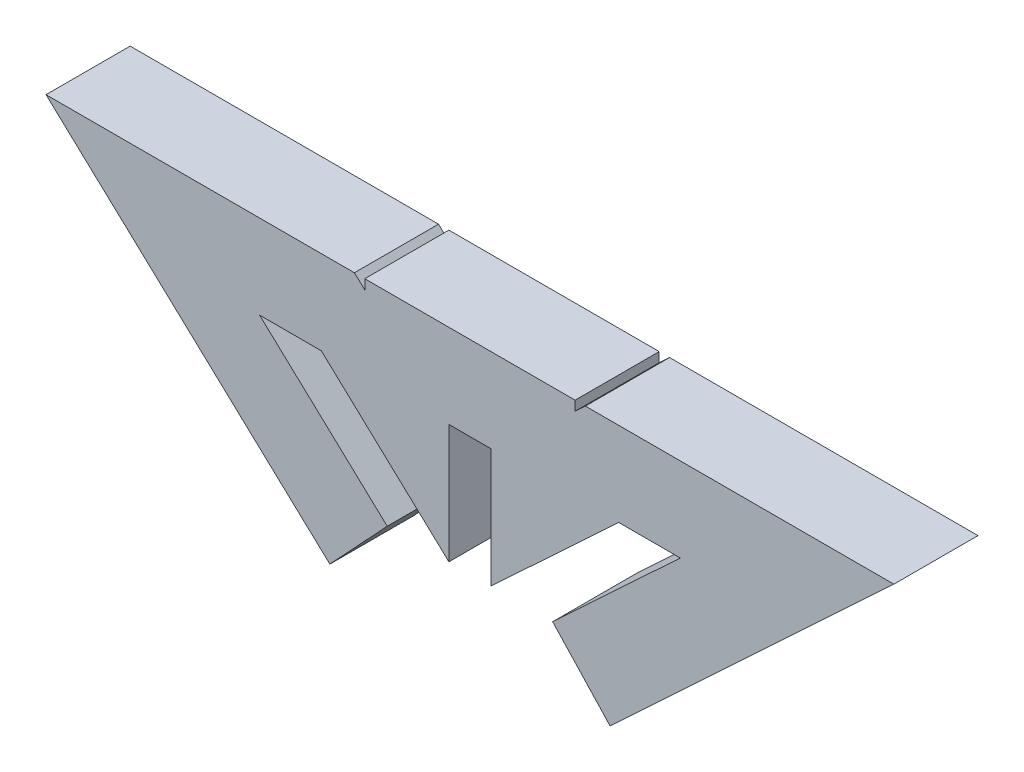
ISO-10303-21;
HEADER;
FILE_DESCRIPTION(('STEP AP214'),'2;1');
FILE_NAME('part.step','',(''),(''),'','','');
FILE_SCHEMA(('AUTOMOTIVE_DESIGN { 1 0 10303 214 1 1 1 1 }'));
ENDSEC;
DATA;
#1=APPLICATION_CONTEXT('core data for automotive mechanical design processes');
#2=APPLICATION_PROTOCOL_DEFINITION('international standard','automotive_design',2000,#1);
#3=PRODUCT_CONTEXT('',#1,'mechanical');
#4=PRODUCT('Part','Part','',(#3));
#5=PRODUCT_RELATED_PRODUCT_CATEGORY('part','',(#4));
#6=PRODUCT_DEFINITION_FORMATION('','',#4);
#7=PRODUCT_DEFINITION_CONTEXT('part definition',#1,'design');
#8=PRODUCT_DEFINITION('design','',#6,#7);
#9=PRODUCT_DEFINITION_SHAPE('','',#8);
#10=(LENGTH_UNIT() NAMED_UNIT(*) SI_UNIT(.MILLI.,.METRE.));
#11=(NAMED_UNIT(*) PLANE_ANGLE_UNIT() SI_UNIT($,.RADIAN.));
#12=(NAMED_UNIT(*) SI_UNIT($,.STERADIAN.) SOLID_ANGLE_UNIT());
#13=UNCERTAINTY_MEASURE_WITH_UNIT(LENGTH_MEASURE(1.E-05),#10,'distance_accuracy_value','');
#14=(GEOMETRIC_REPRESENTATION_CONTEXT(3) GLOBAL_UNCERTAINTY_ASSIGNED_CONTEXT((#13)) GLOBAL_UNIT_ASSIGNED_CONTEXT((#10,
#11,#12)) REPRESENTATION_CONTEXT('',''));
#15=CARTESIAN_POINT('',(0.,0.,0.));
#16=DIRECTION('',(0.,0.,1.));
#17=DIRECTION('',(1.,0.,0.));
#18=AXIS2_PLACEMENT_3D('',#15,#16,#17);
#19=CARTESIAN_POINT('',(-31.8196056999105,-7.31388939605655,10.));
#20=DIRECTION('',(0.681960569991049,0.731388939605655,0.));
#21=DIRECTION('',(-0.731388939605655,0.681960569991049,0.));
#22=AXIS2_PLACEMENT_3D('',#19,#20,#21);
#23=PLANE('',#22);
#24=DIRECTION('',(0.731388939605655,-0.681960569991049,0.));
#25=VECTOR('',#24,1.);
#26=CARTESIAN_POINT('',(-31.8196056999105,-7.31388939605655,0.));
#27=LINE('',#26,#25);
#28=CARTESIAN_POINT('',(-50.3884024354719,10.,0.));
#29=VERTEX_POINT('',#28);
#30=CARTESIAN_POINT('',(-16.6514078890981,-21.4569974807589,0.));
#31=VERTEX_POINT('',#30);
#32=EDGE_CURVE('E200',#29,#31,#27,.T.);
#33=ORIENTED_EDGE('',*,*,#32,.T.);
#34=DIRECTION('',(0.,0.,-1.));
#35=VECTOR('',#34,1.);
#36=CARTESIAN_POINT('',(-16.6514078890981,-21.4569974807589,10.));
#37=LINE('',#36,#35);
#38=CARTESIAN_POINT('',(-16.6514078890981,-21.4569974807589,10.));
#39=VERTEX_POINT('',#38);
#40=EDGE_CURVE('E11',#39,#31,#37,.T.);
#41=ORIENTED_EDGE('',*,*,#40,.F.);
#42=DIRECTION('',(0.731388939605655,-0.681960569991049,0.));
#43=VECTOR('',#42,1.);
#44=CARTESIAN_POINT('',(-31.8196056999105,-7.31388939605655,10.));
#45=LINE('',#44,#43);
#46=CARTESIAN_POINT('',(-50.3884024354719,10.,10.));
#47=VERTEX_POINT('',#46);
#48=EDGE_CURVE('E125',#47,#39,#45,.T.);
#49=ORIENTED_EDGE('',*,*,#48,.F.);
#50=DIRECTION('',(0.,0.,-1.));
#51=VECTOR('',#50,1.);
#52=CARTESIAN_POINT('',(-50.3884024354719,10.,10.));
#53=LINE('',#52,#51);
#54=EDGE_CURVE('E196',#47,#29,#53,.T.);
#55=ORIENTED_EDGE('',*,*,#54,.T.);
#56=EDGE_LOOP('',(#33,#41,#49,#55));
#57=FACE_BOUND('',#56,.T.);
#58=ADVANCED_FACE('F33',(#57),#23,.F.);
#59=CARTESIAN_POINT('',(-9.83180218918761,-14.1431080847023,10.));
#60=DIRECTION('',(0.731388939605655,-0.681960569991049,0.));
#61=DIRECTION('',(0.681960569991049,0.731388939605655,0.));
#62=AXIS2_PLACEMENT_3D('',#59,#60,#61);
#63=PLANE('',#62);
#64=DIRECTION('',(-0.681960569991049,-0.731388939605655,0.));
#65=VECTOR('',#64,1.);
#66=CARTESIAN_POINT('',(-9.83180218918761,-14.1431080847023,0.));
#67=LINE('',#66,#65);
#68=CARTESIAN_POINT('',(-9.83180218918761,-14.1431080847023,0.));
#69=VERTEX_POINT('',#68);
#70=EDGE_CURVE('E203',#69,#31,#67,.T.);
#71=ORIENTED_EDGE('',*,*,#70,.F.);
#72=DIRECTION('',(0.,0.,-1.));
#73=VECTOR('',#72,1.);
#74=CARTESIAN_POINT('',(-9.83180218918761,-14.1431080847023,10.));
#75=LINE('',#74,#73);
#76=CARTESIAN_POINT('',(-9.83180218918761,-14.1431080847023,10.));
#77=VERTEX_POINT('',#76);
#78=EDGE_CURVE('E41',#77,#69,#75,.T.);
#79=ORIENTED_EDGE('',*,*,#78,.F.);
#80=DIRECTION('',(-0.681960569991049,-0.731388939605655,0.));
#81=VECTOR('',#80,1.);
#82=CARTESIAN_POINT('',(-9.83180218918761,-14.1431080847023,10.));
#83=LINE('',#82,#81);
#84=EDGE_CURVE('E305',#77,#39,#83,.T.);
#85=ORIENTED_EDGE('',*,*,#84,.T.);
#86=ORIENTED_EDGE('',*,*,#40,.T.);
#87=EDGE_LOOP('',(#71,#79,#85,#86));
#88=FACE_BOUND('',#87,.T.);
#89=ADVANCED_FACE('F292',(#88),#63,.T.);
#90=CARTESIAN_POINT('',(-25.,0.,10.));
#91=DIRECTION('',(0.681960569991049,0.731388939605655,0.));
#92=DIRECTION('',(-0.731388939605655,0.681960569991049,0.));
#93=AXIS2_PLACEMENT_3D('',#90,#91,#92);
#94=PLANE('',#93);
#95=DIRECTION('',(0.731388939605655,-0.681960569991049,0.));
#96=VECTOR('',#95,1.);
#97=CARTESIAN_POINT('',(-25.,0.,0.));
#98=LINE('',#97,#96);
#99=CARTESIAN_POINT('',(-25.,0.,0.));
#100=VERTEX_POINT('',#99);
#101=EDGE_CURVE('E206',#100,#69,#98,.T.);
#102=ORIENTED_EDGE('',*,*,#101,.F.);
#103=DIRECTION('',(0.,0.,-1.));
#104=VECTOR('',#103,1.);
#105=CARTESIAN_POINT('',(-25.,0.,10.));
#106=LINE('',#105,#104);
#107=CARTESIAN_POINT('',(-25.,0.,10.));
#108=VERTEX_POINT('',#107);
#109=EDGE_CURVE('E282',#108,#100,#106,.T.);
#110=ORIENTED_EDGE('',*,*,#109,.F.);
#111=DIRECTION('',(0.731388939605655,-0.681960569991049,0.));
#112=VECTOR('',#111,1.);
#113=CARTESIAN_POINT('',(-25.,0.,10.));
#114=LINE('',#113,#112);
#115=EDGE_CURVE('E289',#108,#77,#114,.T.);
#116=ORIENTED_EDGE('',*,*,#115,.T.);
#117=ORIENTED_EDGE('',*,*,#78,.T.);
#118=EDGE_LOOP('',(#102,#110,#116,#117));
#119=FACE_BOUND('',#118,.T.);
#120=ADVANCED_FACE('F287',(#119),#94,.T.);
#121=CARTESIAN_POINT('',(-17.6681978108124,0.,10.));
#122=DIRECTION('',(0.,-1.,0.));
#123=DIRECTION('',(1.,0.,0.));
#124=AXIS2_PLACEMENT_3D('',#121,#122,#123);
#125=PLANE('',#124);
#126=DIRECTION('',(-1.,0.,0.));
#127=VECTOR('',#126,1.);
#128=CARTESIAN_POINT('',(-17.6681978108124,0.,0.));
#129=LINE('',#128,#127);
#130=CARTESIAN_POINT('',(-17.6681978108124,0.,0.));
#131=VERTEX_POINT('',#130);
#132=EDGE_CURVE('E209',#131,#100,#129,.T.);
#133=ORIENTED_EDGE('',*,*,#132,.F.);
#134=DIRECTION('',(0.,0.,-1.));
#135=VECTOR('',#134,1.);
#136=CARTESIAN_POINT('',(-17.6681978108124,0.,10.));
#137=LINE('',#136,#135);
#138=CARTESIAN_POINT('',(-17.6681978108124,0.,10.));
#139=VERTEX_POINT('',#138);
#140=EDGE_CURVE('E280',#139,#131,#137,.T.);
#141=ORIENTED_EDGE('',*,*,#140,.F.);
#142=DIRECTION('',(-1.,0.,0.));
#143=VECTOR('',#142,1.);
#144=CARTESIAN_POINT('',(-17.6681978108124,0.,10.));
#145=LINE('',#144,#143);
#146=EDGE_CURVE('E302',#139,#108,#145,.T.);
#147=ORIENTED_EDGE('',*,*,#146,.T.);
#148=ORIENTED_EDGE('',*,*,#109,.T.);
#149=EDGE_LOOP('',(#133,#141,#147,#148));
#150=FACE_BOUND('',#149,.T.);
#151=ADVANCED_FACE('F299',(#150),#125,.T.);
#152=CARTESIAN_POINT('',(-2.5,-14.1431080847023,10.));
#153=DIRECTION('',(-0.681960569991048,-0.731388939605655,0.));
#154=DIRECTION('',(0.731388939605655,-0.681960569991048,0.));
#155=AXIS2_PLACEMENT_3D('',#152,#153,#154);
#156=PLANE('',#155);
#157=DIRECTION('',(-0.731388939605655,0.681960569991048,0.));
#158=VECTOR('',#157,1.);
#159=CARTESIAN_POINT('',(-2.5,-14.1431080847023,0.));
#160=LINE('',#159,#158);
#161=CARTESIAN_POINT('',(-2.5,-14.1431080847023,0.));
#162=VERTEX_POINT('',#161);
#163=EDGE_CURVE('E212',#162,#131,#160,.T.);
#164=ORIENTED_EDGE('',*,*,#163,.F.);
#165=DIRECTION('',(0.,0.,-1.));
#166=VECTOR('',#165,1.);
#167=CARTESIAN_POINT('',(-2.5,-14.1431080847023,10.));
#168=LINE('',#167,#166);
#169=CARTESIAN_POINT('',(-2.5,-14.1431080847023,10.));
#170=VERTEX_POINT('',#169);
#171=EDGE_CURVE('E278',#170,#162,#168,.T.);
#172=ORIENTED_EDGE('',*,*,#171,.F.);
#173=DIRECTION('',(-0.731388939605655,0.681960569991048,0.));
#174=VECTOR('',#173,1.);
#175=CARTESIAN_POINT('',(-2.5,-14.1431080847023,10.));
#176=LINE('',#175,#174);
#177=EDGE_CURVE('E307',#170,#139,#176,.T.);
#178=ORIENTED_EDGE('',*,*,#177,.T.);
#179=ORIENTED_EDGE('',*,*,#140,.T.);
#180=EDGE_LOOP('',(#164,#172,#178,#179));
#181=FACE_BOUND('',#180,.T.);
#182=ADVANCED_FACE('F373',(#181),#156,.T.);
#183=CARTESIAN_POINT('',(-2.5,0.,10.));
#184=DIRECTION('',(1.,0.,0.));
#185=DIRECTION('',(0.,1.,0.));
#186=AXIS2_PLACEMENT_3D('',#183,#184,#185);
#187=PLANE('',#186);
#188=DIRECTION('',(0.,-1.,0.));
#189=VECTOR('',#188,1.);
#190=CARTESIAN_POINT('',(-2.5,0.,0.));
#191=LINE('',#190,#189);
#192=CARTESIAN_POINT('',(-2.5,0.,0.));
#193=VERTEX_POINT('',#192);
#194=EDGE_CURVE('E215',#193,#162,#191,.T.);
#195=ORIENTED_EDGE('',*,*,#194,.F.);
#196=DIRECTION('',(0.,0.,-1.));
#197=VECTOR('',#196,1.);
#198=CARTESIAN_POINT('',(-2.5,0.,10.));
#199=LINE('',#198,#197);
#200=CARTESIAN_POINT('',(-2.5,0.,10.));
#201=VERTEX_POINT('',#200);
#202=EDGE_CURVE('E276',#201,#193,#199,.T.);
#203=ORIENTED_EDGE('',*,*,#202,.F.);
#204=DIRECTION('',(0.,-1.,0.));
#205=VECTOR('',#204,1.);
#206=CARTESIAN_POINT('',(-2.5,0.,10.));
#207=LINE('',#206,#205);
#208=EDGE_CURVE('E313',#201,#170,#207,.T.);
#209=ORIENTED_EDGE('',*,*,#208,.T.);
#210=ORIENTED_EDGE('',*,*,#171,.T.);
#211=EDGE_LOOP('',(#195,#203,#209,#210));
#212=FACE_BOUND('',#211,.T.);
#213=ADVANCED_FACE('F376',(#212),#187,.T.);
#214=CARTESIAN_POINT('',(-2.5,0.,10.));
#215=DIRECTION('',(0.,-1.,0.));
#216=DIRECTION('',(1.,0.,0.));
#217=AXIS2_PLACEMENT_3D('',#214,#215,#216);
#218=PLANE('',#217);
#219=DIRECTION('',(-1.,0.,0.));
#220=VECTOR('',#219,1.);
#221=CARTESIAN_POINT('',(-2.5,0.,0.));
#222=LINE('',#221,#220);
#223=CARTESIAN_POINT('',(2.5,0.,0.));
#224=VERTEX_POINT('',#223);
#225=EDGE_CURVE('E218',#224,#193,#222,.T.);
#226=ORIENTED_EDGE('',*,*,#225,.F.);
#227=DIRECTION('',(0.,0.,-1.));
#228=VECTOR('',#227,1.);
#229=CARTESIAN_POINT('',(2.5,0.,10.));
#230=LINE('',#229,#228);
#231=CARTESIAN_POINT('',(2.5,0.,10.));
#232=VERTEX_POINT('',#231);
#233=EDGE_CURVE('E274',#232,#224,#230,.T.);
#234=ORIENTED_EDGE('',*,*,#233,.F.);
#235=DIRECTION('',(-1.,0.,0.));
#236=VECTOR('',#235,1.);
#237=CARTESIAN_POINT('',(-2.5,0.,10.));
#238=LINE('',#237,#236);
#239=EDGE_CURVE('E316',#232,#201,#238,.T.);
#240=ORIENTED_EDGE('',*,*,#239,.T.);
#241=ORIENTED_EDGE('',*,*,#202,.T.);
#242=EDGE_LOOP('',(#226,#234,#240,#241));
#243=FACE_BOUND('',#242,.T.);
#244=ADVANCED_FACE('F380',(#243),#218,.T.);
#245=CARTESIAN_POINT('',(2.5,0.,10.));
#246=DIRECTION('',(-1.,0.,0.));
#247=DIRECTION('',(0.,-1.,0.));
#248=AXIS2_PLACEMENT_3D('',#245,#246,#247);
#249=PLANE('',#248);
#250=DIRECTION('',(0.,1.,0.));
#251=VECTOR('',#250,1.);
#252=CARTESIAN_POINT('',(2.5,0.,0.));
#253=LINE('',#252,#251);
#254=CARTESIAN_POINT('',(2.5,-14.1431080847023,0.));
#255=VERTEX_POINT('',#254);
#256=EDGE_CURVE('E221',#255,#224,#253,.T.);
#257=ORIENTED_EDGE('',*,*,#256,.F.);
#258=DIRECTION('',(0.,0.,-1.));
#259=VECTOR('',#258,1.);
#260=CARTESIAN_POINT('',(2.5,-14.1431080847023,10.));
#261=LINE('',#260,#259);
#262=CARTESIAN_POINT('',(2.5,-14.1431080847023,10.));
#263=VERTEX_POINT('',#262);
#264=EDGE_CURVE('E272',#263,#255,#261,.T.);
#265=ORIENTED_EDGE('',*,*,#264,.F.);
#266=DIRECTION('',(0.,1.,0.));
#267=VECTOR('',#266,1.);
#268=CARTESIAN_POINT('',(2.5,0.,10.));
#269=LINE('',#268,#267);
#270=EDGE_CURVE('E319',#263,#232,#269,.T.);
#271=ORIENTED_EDGE('',*,*,#270,.T.);
#272=ORIENTED_EDGE('',*,*,#233,.T.);
#273=EDGE_LOOP('',(#257,#265,#271,#272));
#274=FACE_BOUND('',#273,.T.);
#275=ADVANCED_FACE('F384',(#274),#249,.T.);
#276=CARTESIAN_POINT('',(2.5,-14.1431080847023,10.));
#277=DIRECTION('',(0.681960569991049,-0.731388939605655,0.));
#278=DIRECTION('',(0.731388939605655,0.681960569991049,0.));
#279=AXIS2_PLACEMENT_3D('',#276,#277,#278);
#280=PLANE('',#279);
#281=DIRECTION('',(-0.731388939605655,-0.681960569991049,0.));
#282=VECTOR('',#281,1.);
#283=CARTESIAN_POINT('',(2.5,-14.1431080847023,0.));
#284=LINE('',#283,#282);
#285=CARTESIAN_POINT('',(17.6681978108124,0.,0.));
#286=VERTEX_POINT('',#285);
#287=EDGE_CURVE('E224',#286,#255,#284,.T.);
#288=ORIENTED_EDGE('',*,*,#287,.F.);
#289=DIRECTION('',(0.,0.,-1.));
#290=VECTOR('',#289,1.);
#291=CARTESIAN_POINT('',(17.6681978108124,0.,10.));
#292=LINE('',#291,#290);
#293=CARTESIAN_POINT('',(17.6681978108124,0.,10.));
#294=VERTEX_POINT('',#293);
#295=EDGE_CURVE('E270',#294,#286,#292,.T.);
#296=ORIENTED_EDGE('',*,*,#295,.F.);
#297=DIRECTION('',(-0.731388939605655,-0.681960569991049,0.));
#298=VECTOR('',#297,1.);
#299=CARTESIAN_POINT('',(2.5,-14.1431080847023,10.));
#300=LINE('',#299,#298);
#301=EDGE_CURVE('E322',#294,#263,#300,.T.);
#302=ORIENTED_EDGE('',*,*,#301,.T.);
#303=ORIENTED_EDGE('',*,*,#264,.T.);
#304=EDGE_LOOP('',(#288,#296,#302,#303));
#305=FACE_BOUND('',#304,.T.);
#306=ADVANCED_FACE('F388',(#305),#280,.T.);
#307=CARTESIAN_POINT('',(17.6681978108124,0.,10.));
#308=DIRECTION('',(0.,-1.,0.));
#309=DIRECTION('',(1.,0.,0.));
#310=AXIS2_PLACEMENT_3D('',#307,#308,#309);
#311=PLANE('',#310);
#312=DIRECTION('',(-1.,0.,0.));
#313=VECTOR('',#312,1.);
#314=CARTESIAN_POINT('',(17.6681978108124,0.,0.));
#315=LINE('',#314,#313);
#316=CARTESIAN_POINT('',(25.,0.,0.));
#317=VERTEX_POINT('',#316);
#318=EDGE_CURVE('E227',#317,#286,#315,.T.);
#319=ORIENTED_EDGE('',*,*,#318,.F.);
#320=DIRECTION('',(0.,0.,-1.));
#321=VECTOR('',#320,1.);
#322=CARTESIAN_POINT('',(25.,0.,10.));
#323=LINE('',#322,#321);
#324=CARTESIAN_POINT('',(25.,0.,10.));
#325=VERTEX_POINT('',#324);
#326=EDGE_CURVE('E268',#325,#317,#323,.T.);
#327=ORIENTED_EDGE('',*,*,#326,.F.);
#328=DIRECTION('',(-1.,0.,0.));
#329=VECTOR('',#328,1.);
#330=CARTESIAN_POINT('',(17.6681978108124,0.,10.));
#331=LINE('',#330,#329);
#332=EDGE_CURVE('E325',#325,#294,#331,.T.);
#333=ORIENTED_EDGE('',*,*,#332,.T.);
#334=ORIENTED_EDGE('',*,*,#295,.T.);
#335=EDGE_LOOP('',(#319,#327,#333,#334));
#336=FACE_BOUND('',#335,.T.);
#337=ADVANCED_FACE('F392',(#336),#311,.T.);
#338=CARTESIAN_POINT('',(25.,0.,10.));
#339=DIRECTION('',(-0.681960569991049,0.731388939605655,0.));
#340=DIRECTION('',(-0.731388939605655,-0.681960569991049,0.));
#341=AXIS2_PLACEMENT_3D('',#338,#339,#340);
#342=PLANE('',#341);
#343=DIRECTION('',(0.731388939605655,0.681960569991049,0.));
#344=VECTOR('',#343,1.);
#345=CARTESIAN_POINT('',(25.,0.,0.));
#346=LINE('',#345,#344);
#347=CARTESIAN_POINT('',(9.83180218918762,-14.1431080847023,0.));
#348=VERTEX_POINT('',#347);
#349=EDGE_CURVE('E230',#348,#317,#346,.T.);
#350=ORIENTED_EDGE('',*,*,#349,.F.);
#351=DIRECTION('',(0.,0.,-1.));
#352=VECTOR('',#351,1.);
#353=CARTESIAN_POINT('',(9.83180218918762,-14.1431080847023,10.));
#354=LINE('',#353,#352);
#355=CARTESIAN_POINT('',(9.83180218918762,-14.1431080847023,10.));
#356=VERTEX_POINT('',#355);
#357=EDGE_CURVE('E266',#356,#348,#354,.T.);
#358=ORIENTED_EDGE('',*,*,#357,.F.);
#359=DIRECTION('',(0.731388939605655,0.681960569991049,0.));
#360=VECTOR('',#359,1.);
#361=CARTESIAN_POINT('',(25.,0.,10.));
#362=LINE('',#361,#360);
#363=EDGE_CURVE('E328',#356,#325,#362,.T.);
#364=ORIENTED_EDGE('',*,*,#363,.T.);
#365=ORIENTED_EDGE('',*,*,#326,.T.);
#366=EDGE_LOOP('',(#350,#358,#364,#365));
#367=FACE_BOUND('',#366,.T.);
#368=ADVANCED_FACE('F396',(#367),#342,.T.);
#369=CARTESIAN_POINT('',(16.6514078890981,-21.4569974807589,10.));
#370=DIRECTION('',(-0.731388939605655,-0.681960569991049,0.));
#371=DIRECTION('',(0.681960569991049,-0.731388939605655,0.));
#372=AXIS2_PLACEMENT_3D('',#369,#370,#371);
#373=PLANE('',#372);
#374=DIRECTION('',(-0.681960569991049,0.731388939605655,0.));
#375=VECTOR('',#374,1.);
#376=CARTESIAN_POINT('',(16.6514078890981,-21.4569974807589,0.));
#377=LINE('',#376,#375);
#378=CARTESIAN_POINT('',(16.6514078890981,-21.4569974807589,0.));
#379=VERTEX_POINT('',#378);
#380=EDGE_CURVE('E233',#379,#348,#377,.T.);
#381=ORIENTED_EDGE('',*,*,#380,.F.);
#382=DIRECTION('',(0.,0.,-1.));
#383=VECTOR('',#382,1.);
#384=CARTESIAN_POINT('',(16.6514078890981,-21.4569974807589,10.));
#385=LINE('',#384,#383);
#386=CARTESIAN_POINT('',(16.6514078890981,-21.4569974807589,10.));
#387=VERTEX_POINT('',#386);
#388=EDGE_CURVE('E264',#387,#379,#385,.T.);
#389=ORIENTED_EDGE('',*,*,#388,.F.);
#390=DIRECTION('',(-0.681960569991049,0.731388939605655,0.));
#391=VECTOR('',#390,1.);
#392=CARTESIAN_POINT('',(16.6514078890981,-21.4569974807589,10.));
#393=LINE('',#392,#391);
#394=EDGE_CURVE('E331',#387,#356,#393,.T.);
#395=ORIENTED_EDGE('',*,*,#394,.T.);
#396=ORIENTED_EDGE('',*,*,#357,.T.);
#397=EDGE_LOOP('',(#381,#389,#395,#396));
#398=FACE_BOUND('',#397,.T.);
#399=ADVANCED_FACE('F400',(#398),#373,.T.);
#400=CARTESIAN_POINT('',(31.8196056999105,-7.31388939605655,10.));
#401=DIRECTION('',(-0.681960569991049,0.731388939605655,0.));
#402=DIRECTION('',(-0.731388939605655,-0.681960569991049,0.));
#403=AXIS2_PLACEMENT_3D('',#400,#401,#402);
#404=PLANE('',#403);
#405=DIRECTION('',(0.731388939605655,0.681960569991049,0.));
#406=VECTOR('',#405,1.);
#407=CARTESIAN_POINT('',(31.8196056999105,-7.31388939605655,0.));
#408=LINE('',#407,#406);
#409=CARTESIAN_POINT('',(50.3884024354719,10.,0.));
#410=VERTEX_POINT('',#409);
#411=EDGE_CURVE('E236',#379,#410,#408,.T.);
#412=ORIENTED_EDGE('',*,*,#411,.T.);
#413=DIRECTION('',(0.,0.,-1.));
#414=VECTOR('',#413,1.);
#415=CARTESIAN_POINT('',(50.3884024354719,10.,10.));
#416=LINE('',#415,#414);
#417=CARTESIAN_POINT('',(50.3884024354719,10.,10.));
#418=VERTEX_POINT('',#417);
#419=EDGE_CURVE('E261',#418,#410,#416,.T.);
#420=ORIENTED_EDGE('',*,*,#419,.F.);
#421=DIRECTION('',(0.731388939605655,0.681960569991049,0.));
#422=VECTOR('',#421,1.);
#423=CARTESIAN_POINT('',(31.8196056999105,-7.31388939605655,10.));
#424=LINE('',#423,#422);
#425=EDGE_CURVE('E334',#387,#418,#424,.T.);
#426=ORIENTED_EDGE('',*,*,#425,.F.);
#427=ORIENTED_EDGE('',*,*,#388,.T.);
#428=EDGE_LOOP('',(#412,#420,#426,#427));
#429=FACE_BOUND('',#428,.T.);
#430=ADVANCED_FACE('F404',(#429),#404,.F.);
#431=CARTESIAN_POINT('',(17.6681978108124,10.,10.));
#432=DIRECTION('',(0.,-1.,0.));
#433=DIRECTION('',(1.,0.,0.));
#434=AXIS2_PLACEMENT_3D('',#431,#432,#433);
#435=PLANE('',#434);
#436=DIRECTION('',(-1.,0.,0.));
#437=VECTOR('',#436,1.);
#438=CARTESIAN_POINT('',(17.6681978108124,10.,0.));
#439=LINE('',#438,#437);
#440=CARTESIAN_POINT('',(13.7293914895339,10.,0.));
#441=VERTEX_POINT('',#440);
#442=EDGE_CURVE('E238',#410,#441,#439,.T.);
#443=ORIENTED_EDGE('',*,*,#442,.T.);
#444=DIRECTION('',(0.,0.,-1.));
#445=VECTOR('',#444,1.);
#446=CARTESIAN_POINT('',(13.7293914895339,10.,10.));
#447=LINE('',#446,#445);
#448=CARTESIAN_POINT('',(13.7293914895339,10.,10.));
#449=VERTEX_POINT('',#448);
#450=EDGE_CURVE('E258',#449,#441,#447,.T.);
#451=ORIENTED_EDGE('',*,*,#450,.F.);
#452=DIRECTION('',(-1.,0.,0.));
#453=VECTOR('',#452,1.);
#454=CARTESIAN_POINT('',(17.6681978108124,10.,10.));
#455=LINE('',#454,#453);
#456=EDGE_CURVE('E336',#418,#449,#455,.T.);
#457=ORIENTED_EDGE('',*,*,#456,.F.);
#458=ORIENTED_EDGE('',*,*,#419,.T.);
#459=EDGE_LOOP('',(#443,#451,#457,#458));
#460=FACE_BOUND('',#459,.T.);
#461=ADVANCED_FACE('F408',(#460),#435,.F.);
#462=CARTESIAN_POINT('',(-4.31960569991048,-6.82921868864577,10.));
#463=DIRECTION('',(0.681960569991049,-0.731388939605655,0.));
#464=DIRECTION('',(0.731388939605655,0.681960569991049,0.));
#465=AXIS2_PLACEMENT_3D('',#462,#463,#464);
#466=PLANE('',#465);
#467=DIRECTION('',(-0.731388939605655,-0.681960569991049,0.));
#468=VECTOR('',#467,1.);
#469=CARTESIAN_POINT('',(-4.31960569991048,-6.82921868864577,0.));
#470=LINE('',#469,#468);
#471=CARTESIAN_POINT('',(12.5,8.85369264485091,0.));
#472=VERTEX_POINT('',#471);
#473=EDGE_CURVE('E240',#441,#472,#470,.T.);
#474=ORIENTED_EDGE('',*,*,#473,.T.);
#475=DIRECTION('',(0.,0.,-1.));
#476=VECTOR('',#475,1.);
#477=CARTESIAN_POINT('',(12.5,8.85369264485091,10.));
#478=LINE('',#477,#476);
#479=CARTESIAN_POINT('',(12.5,8.85369264485091,10.));
#480=VERTEX_POINT('',#479);
#481=EDGE_CURVE('E255',#480,#472,#478,.T.);
#482=ORIENTED_EDGE('',*,*,#481,.F.);
#483=DIRECTION('',(-0.731388939605655,-0.681960569991049,0.));
#484=VECTOR('',#483,1.);
#485=CARTESIAN_POINT('',(-4.31960569991048,-6.82921868864577,10.));
#486=LINE('',#485,#484);
#487=EDGE_CURVE('E338',#449,#480,#486,.T.);
#488=ORIENTED_EDGE('',*,*,#487,.F.);
#489=ORIENTED_EDGE('',*,*,#450,.T.);
#490=EDGE_LOOP('',(#474,#482,#488,#489));
#491=FACE_BOUND('',#490,.T.);
#492=ADVANCED_FACE('F412',(#491),#466,.F.);
#493=CARTESIAN_POINT('',(12.5,0.,10.));
#494=DIRECTION('',(-1.,0.,0.));
#495=DIRECTION('',(0.,-1.,0.));
#496=AXIS2_PLACEMENT_3D('',#493,#494,#495);
#497=PLANE('',#496);
#498=DIRECTION('',(0.,1.,0.));
#499=VECTOR('',#498,1.);
#500=CARTESIAN_POINT('',(12.5,0.,0.));
#501=LINE('',#500,#499);
#502=CARTESIAN_POINT('',(12.5,10.,0.));
#503=VERTEX_POINT('',#502);
#504=EDGE_CURVE('E242',#472,#503,#501,.T.);
#505=ORIENTED_EDGE('',*,*,#504,.T.);
#506=DIRECTION('',(0.,0.,-1.));
#507=VECTOR('',#506,1.);
#508=CARTESIAN_POINT('',(12.5,10.,10.));
#509=LINE('',#508,#507);
#510=CARTESIAN_POINT('',(12.5,10.,10.));
#511=VERTEX_POINT('',#510);
#512=EDGE_CURVE('E252',#511,#503,#509,.T.);
#513=ORIENTED_EDGE('',*,*,#512,.F.);
#514=DIRECTION('',(0.,1.,0.));
#515=VECTOR('',#514,1.);
#516=CARTESIAN_POINT('',(12.5,0.,10.));
#517=LINE('',#516,#515);
#518=EDGE_CURVE('E340',#480,#511,#517,.T.);
#519=ORIENTED_EDGE('',*,*,#518,.F.);
#520=ORIENTED_EDGE('',*,*,#481,.T.);
#521=EDGE_LOOP('',(#505,#513,#519,#520));
#522=FACE_BOUND('',#521,.T.);
#523=ADVANCED_FACE('F346',(#522),#497,.F.);
#524=CARTESIAN_POINT('',(-2.5,10.,10.));
#525=DIRECTION('',(0.,-1.,0.));
#526=DIRECTION('',(1.,0.,0.));
#527=AXIS2_PLACEMENT_3D('',#524,#525,#526);
#528=PLANE('',#527);
#529=DIRECTION('',(-1.,0.,0.));
#530=VECTOR('',#529,1.);
#531=CARTESIAN_POINT('',(-2.5,10.,0.));
#532=LINE('',#531,#530);
#533=CARTESIAN_POINT('',(-12.5,10.,0.));
#534=VERTEX_POINT('',#533);
#535=EDGE_CURVE('E244',#503,#534,#532,.T.);
#536=ORIENTED_EDGE('',*,*,#535,.T.);
#537=DIRECTION('',(0.,0.,-1.));
#538=VECTOR('',#537,1.);
#539=CARTESIAN_POINT('',(-12.5,10.,10.));
#540=LINE('',#539,#538);
#541=CARTESIAN_POINT('',(-12.5,10.,10.));
#542=VERTEX_POINT('',#541);
#543=EDGE_CURVE('E191',#542,#534,#540,.T.);
#544=ORIENTED_EDGE('',*,*,#543,.F.);
#545=DIRECTION('',(-1.,0.,0.));
#546=VECTOR('',#545,1.);
#547=CARTESIAN_POINT('',(-2.5,10.,10.));
#548=LINE('',#547,#546);
#549=EDGE_CURVE('E182',#511,#542,#548,.T.);
#550=ORIENTED_EDGE('',*,*,#549,.F.);
#551=ORIENTED_EDGE('',*,*,#512,.T.);
#552=EDGE_LOOP('',(#536,#544,#550,#551));
#553=FACE_BOUND('',#552,.T.);
#554=ADVANCED_FACE('F350',(#553),#528,.F.);
#555=CARTESIAN_POINT('',(-12.5,0.,10.));
#556=DIRECTION('',(1.,0.,0.));
#557=DIRECTION('',(0.,1.,0.));
#558=AXIS2_PLACEMENT_3D('',#555,#556,#557);
#559=PLANE('',#558);
#560=DIRECTION('',(0.,-1.,0.));
#561=VECTOR('',#560,1.);
#562=CARTESIAN_POINT('',(-12.5,0.,0.));
#563=LINE('',#562,#561);
#564=CARTESIAN_POINT('',(-12.5,8.85369264485091,0.));
#565=VERTEX_POINT('',#564);
#566=EDGE_CURVE('E190',#534,#565,#563,.T.);
#567=ORIENTED_EDGE('',*,*,#566,.T.);
#568=DIRECTION('',(0.,0.,-1.));
#569=VECTOR('',#568,1.);
#570=CARTESIAN_POINT('',(-12.5,8.85369264485091,10.));
#571=LINE('',#570,#569);
#572=CARTESIAN_POINT('',(-12.5,8.85369264485091,10.));
#573=VERTEX_POINT('',#572);
#574=EDGE_CURVE('E187',#573,#565,#571,.T.);
#575=ORIENTED_EDGE('',*,*,#574,.F.);
#576=DIRECTION('',(0.,-1.,0.));
#577=VECTOR('',#576,1.);
#578=CARTESIAN_POINT('',(-12.5,0.,10.));
#579=LINE('',#578,#577);
#580=EDGE_CURVE('E176',#542,#573,#579,.T.);
#581=ORIENTED_EDGE('',*,*,#580,.F.);
#582=ORIENTED_EDGE('',*,*,#543,.T.);
#583=EDGE_LOOP('',(#567,#575,#581,#582));
#584=FACE_BOUND('',#583,.T.);
#585=ADVANCED_FACE('F188',(#584),#559,.F.);
#586=CARTESIAN_POINT('',(4.31960569991049,-6.82921868864577,10.));
#587=DIRECTION('',(-0.681960569991048,-0.731388939605655,0.));
#588=DIRECTION('',(0.731388939605655,-0.681960569991048,0.));
#589=AXIS2_PLACEMENT_3D('',#586,#587,#588);
#590=PLANE('',#589);
#591=DIRECTION('',(-0.731388939605655,0.681960569991048,0.));
#592=VECTOR('',#591,1.);
#593=CARTESIAN_POINT('',(4.31960569991049,-6.82921868864577,0.));
#594=LINE('',#593,#592);
#595=CARTESIAN_POINT('',(-13.7293914895339,10.,0.));
#596=VERTEX_POINT('',#595);
#597=EDGE_CURVE('E113',#565,#596,#594,.T.);
#598=ORIENTED_EDGE('',*,*,#597,.T.);
#599=DIRECTION('',(0.,0.,-1.));
#600=VECTOR('',#599,1.);
#601=CARTESIAN_POINT('',(-13.7293914895339,10.,10.));
#602=LINE('',#601,#600);
#603=CARTESIAN_POINT('',(-13.7293914895339,10.,10.));
#604=VERTEX_POINT('',#603);
#605=EDGE_CURVE('E192',#604,#596,#602,.T.);
#606=ORIENTED_EDGE('',*,*,#605,.F.);
#607=DIRECTION('',(-0.731388939605655,0.681960569991048,0.));
#608=VECTOR('',#607,1.);
#609=CARTESIAN_POINT('',(4.31960569991049,-6.82921868864577,10.));
#610=LINE('',#609,#608);
#611=EDGE_CURVE('E180',#573,#604,#610,.T.);
#612=ORIENTED_EDGE('',*,*,#611,.F.);
#613=ORIENTED_EDGE('',*,*,#574,.T.);
#614=EDGE_LOOP('',(#598,#606,#612,#613));
#615=FACE_BOUND('',#614,.T.);
#616=ADVANCED_FACE('F194',(#615),#590,.F.);
#617=CARTESIAN_POINT('',(-17.6681978108124,10.,10.));
#618=DIRECTION('',(0.,-1.,0.));
#619=DIRECTION('',(1.,0.,0.));
#620=AXIS2_PLACEMENT_3D('',#617,#618,#619);
#621=PLANE('',#620);
#622=DIRECTION('',(-1.,0.,0.));
#623=VECTOR('',#622,1.);
#624=CARTESIAN_POINT('',(-17.6681978108124,10.,0.));
#625=LINE('',#624,#623);
#626=EDGE_CURVE('E119',#596,#29,#625,.T.);
#627=ORIENTED_EDGE('',*,*,#626,.T.);
#628=ORIENTED_EDGE('',*,*,#54,.F.);
#629=DIRECTION('',(-1.,0.,0.));
#630=VECTOR('',#629,1.);
#631=CARTESIAN_POINT('',(-17.6681978108124,10.,10.));
#632=LINE('',#631,#630);
#633=EDGE_CURVE('E49',#604,#47,#632,.T.);
#634=ORIENTED_EDGE('',*,*,#633,.F.);
#635=ORIENTED_EDGE('',*,*,#605,.T.);
#636=EDGE_LOOP('',(#627,#628,#634,#635));
#637=FACE_BOUND('',#636,.T.);
#638=ADVANCED_FACE('F352',(#637),#621,.F.);
#639=CARTESIAN_POINT('',(0.,0.,10.));
#640=DIRECTION('',(0.,0.,-1.));
#641=DIRECTION('',(-1.,0.,0.));
#642=AXIS2_PLACEMENT_3D('',#639,#640,#641);
#643=PLANE('',#642);
#644=ORIENTED_EDGE('',*,*,#48,.T.);
#645=ORIENTED_EDGE('',*,*,#84,.F.);
#646=ORIENTED_EDGE('',*,*,#115,.F.);
#647=ORIENTED_EDGE('',*,*,#146,.F.);
#648=ORIENTED_EDGE('',*,*,#177,.F.);
#649=ORIENTED_EDGE('',*,*,#208,.F.);
#650=ORIENTED_EDGE('',*,*,#239,.F.);
#651=ORIENTED_EDGE('',*,*,#270,.F.);
#652=ORIENTED_EDGE('',*,*,#301,.F.);
#653=ORIENTED_EDGE('',*,*,#332,.F.);
#654=ORIENTED_EDGE('',*,*,#363,.F.);
#655=ORIENTED_EDGE('',*,*,#394,.F.);
#656=ORIENTED_EDGE('',*,*,#425,.T.);
#657=ORIENTED_EDGE('',*,*,#456,.T.);
#658=ORIENTED_EDGE('',*,*,#487,.T.);
#659=ORIENTED_EDGE('',*,*,#518,.T.);
#660=ORIENTED_EDGE('',*,*,#549,.T.);
#661=ORIENTED_EDGE('',*,*,#580,.T.);
#662=ORIENTED_EDGE('',*,*,#611,.T.);
#663=ORIENTED_EDGE('',*,*,#633,.T.);
#664=EDGE_LOOP('',(#644,#645,#646,#647,#648,#649,#650,#651,#652,#653,#654,#655,#656,#657,#658,
#659,#660,#661,#662,#663));
#665=FACE_BOUND('',#664,.T.);
#666=ADVANCED_FACE('F178',(#665),#643,.F.);
#667=CARTESIAN_POINT('',(0.,0.,0.));
#668=DIRECTION('',(0.,0.,-1.));
#669=DIRECTION('',(-1.,0.,0.));
#670=AXIS2_PLACEMENT_3D('',#667,#668,#669);
#671=PLANE('',#670);
#672=ORIENTED_EDGE('',*,*,#32,.F.);
#673=ORIENTED_EDGE('',*,*,#626,.F.);
#674=ORIENTED_EDGE('',*,*,#597,.F.);
#675=ORIENTED_EDGE('',*,*,#566,.F.);
#676=ORIENTED_EDGE('',*,*,#535,.F.);
#677=ORIENTED_EDGE('',*,*,#504,.F.);
#678=ORIENTED_EDGE('',*,*,#473,.F.);
#679=ORIENTED_EDGE('',*,*,#442,.F.);
#680=ORIENTED_EDGE('',*,*,#411,.F.);
#681=ORIENTED_EDGE('',*,*,#380,.T.);
#682=ORIENTED_EDGE('',*,*,#349,.T.);
#683=ORIENTED_EDGE('',*,*,#318,.T.);
#684=ORIENTED_EDGE('',*,*,#287,.T.);
#685=ORIENTED_EDGE('',*,*,#256,.T.);
#686=ORIENTED_EDGE('',*,*,#225,.T.);
#687=ORIENTED_EDGE('',*,*,#194,.T.);
#688=ORIENTED_EDGE('',*,*,#163,.T.);
#689=ORIENTED_EDGE('',*,*,#132,.T.);
#690=ORIENTED_EDGE('',*,*,#101,.T.);
#691=ORIENTED_EDGE('',*,*,#70,.T.);
#692=EDGE_LOOP('',(#672,#673,#674,#675,#676,#677,#678,#679,#680,#681,#682,#683,#684,#685,#686,
#687,#688,#689,#690,#691));
#693=FACE_BOUND('',#692,.T.);
#694=ADVANCED_FACE('F295',(#693),#671,.T.);
#695=CLOSED_SHELL('',(#58,#89,#120,#151,#182,#213,#244,#275,#306,#337,#368,#399,#430,#461,#492,
#523,#554,#585,#616,#638,#666,#694));
#696=MANIFOLD_SOLID_BREP('B2',#695);
#697=ADVANCED_BREP_SHAPE_REPRESENTATION('',(#18,#696),#14);
#698=SHAPE_DEFINITION_REPRESENTATION(#9,#697);
ENDSEC;
END-ISO-10303-21;
